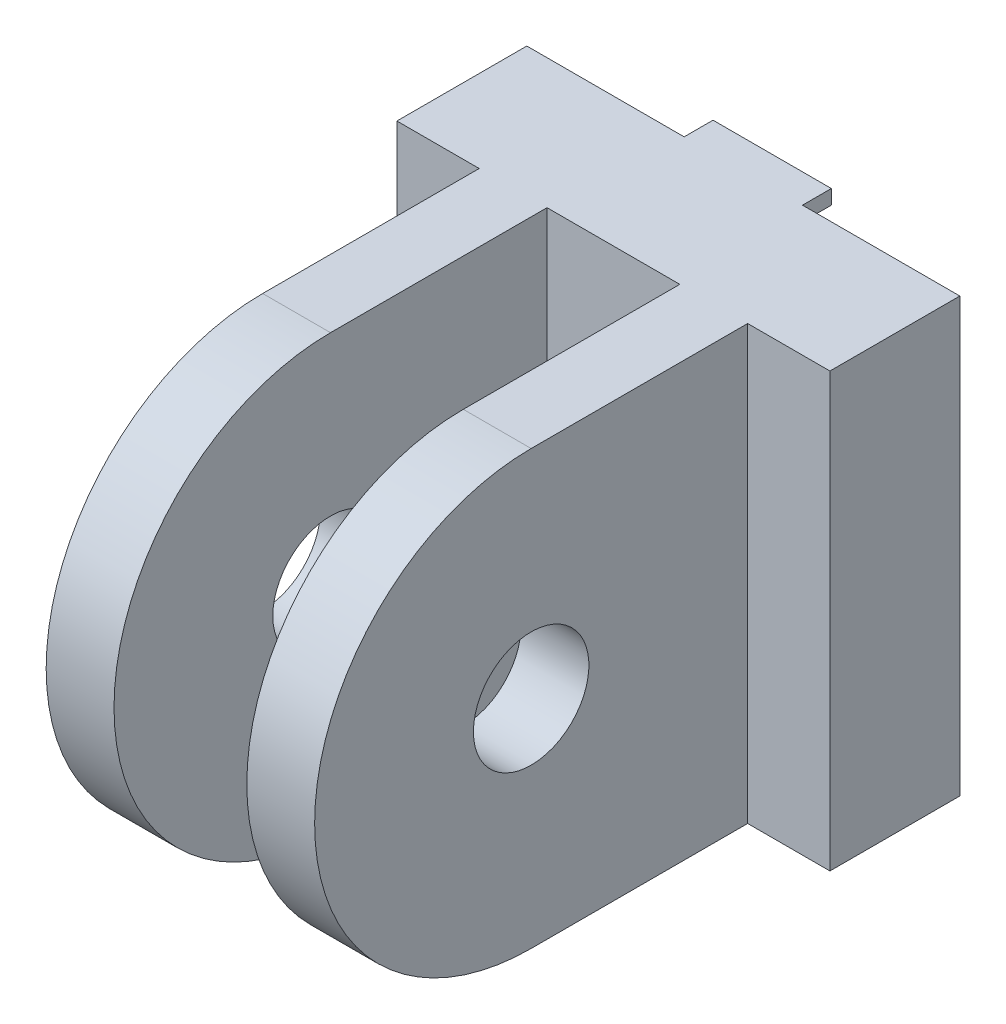
ISO-10303-21;
HEADER;
FILE_DESCRIPTION(('STEP AP214'),'2;1');
FILE_NAME('part.step','',(''),(''),'','','');
FILE_SCHEMA(('AUTOMOTIVE_DESIGN { 1 0 10303 214 1 1 1 1 }'));
ENDSEC;
DATA;
#1=APPLICATION_CONTEXT('core data for automotive mechanical design processes');
#2=APPLICATION_PROTOCOL_DEFINITION('international standard','automotive_design',2000,#1);
#3=PRODUCT_CONTEXT('',#1,'mechanical');
#4=PRODUCT('Part','Part','',(#3));
#5=PRODUCT_RELATED_PRODUCT_CATEGORY('part','',(#4));
#6=PRODUCT_DEFINITION_FORMATION('','',#4);
#7=PRODUCT_DEFINITION_CONTEXT('part definition',#1,'design');
#8=PRODUCT_DEFINITION('design','',#6,#7);
#9=PRODUCT_DEFINITION_SHAPE('','',#8);
#10=(LENGTH_UNIT() NAMED_UNIT(*) SI_UNIT(.MILLI.,.METRE.));
#11=(NAMED_UNIT(*) PLANE_ANGLE_UNIT() SI_UNIT($,.RADIAN.));
#12=(NAMED_UNIT(*) SI_UNIT($,.STERADIAN.) SOLID_ANGLE_UNIT());
#13=UNCERTAINTY_MEASURE_WITH_UNIT(LENGTH_MEASURE(1.E-05),#10,'distance_accuracy_value','');
#14=(GEOMETRIC_REPRESENTATION_CONTEXT(3) GLOBAL_UNCERTAINTY_ASSIGNED_CONTEXT((#13)) GLOBAL_UNIT_ASSIGNED_CONTEXT((#10,
#11,#12)) REPRESENTATION_CONTEXT('',''));
#15=CARTESIAN_POINT('',(0.,0.,0.));
#16=DIRECTION('',(0.,0.,1.));
#17=DIRECTION('',(1.,0.,0.));
#18=AXIS2_PLACEMENT_3D('',#15,#16,#17);
#19=CARTESIAN_POINT('',(15.,15.,0.));
#20=DIRECTION('',(0.,0.,-1.));
#21=DIRECTION('',(-1.,0.,0.));
#22=AXIS2_PLACEMENT_3D('',#19,#20,#21);
#23=PLANE('',#22);
#24=CARTESIAN_POINT('',(0.,0.,0.));
#25=DIRECTION('',(0.,0.,1.));
#26=DIRECTION('',(1.,0.,0.));
#27=AXIS2_PLACEMENT_3D('',#24,#25,#26);
#28=CIRCLE('',#27,4.);
#29=CARTESIAN_POINT('',(4.,0.,0.));
#30=VERTEX_POINT('',#29);
#31=EDGE_CURVE('E315',#30,#30,#28,.T.);
#32=ORIENTED_EDGE('',*,*,#31,.T.);
#33=EDGE_LOOP('',(#32));
#34=FACE_BOUND('',#33,.T.);
#35=DIRECTION('',(1.,0.,0.));
#36=VECTOR('',#35,1.);
#37=CARTESIAN_POINT('',(4.1,-14.,0.));
#38=LINE('',#37,#36);
#39=CARTESIAN_POINT('',(-4.1,-14.,0.));
#40=VERTEX_POINT('',#39);
#41=CARTESIAN_POINT('',(4.1,-14.,0.));
#42=VERTEX_POINT('',#41);
#43=EDGE_CURVE('E428',#40,#42,#38,.T.);
#44=ORIENTED_EDGE('',*,*,#43,.F.);
#45=DIRECTION('',(0.,1.,0.));
#46=VECTOR('',#45,1.);
#47=CARTESIAN_POINT('',(-4.1,-15.,0.));
#48=LINE('',#47,#46);
#49=CARTESIAN_POINT('',(-4.1,-15.,0.));
#50=VERTEX_POINT('',#49);
#51=EDGE_CURVE('E426',#50,#40,#48,.T.);
#52=ORIENTED_EDGE('',*,*,#51,.F.);
#53=DIRECTION('',(1.,0.,0.));
#54=VECTOR('',#53,1.);
#55=CARTESIAN_POINT('',(-15.,-15.,0.));
#56=LINE('',#55,#54);
#57=CARTESIAN_POINT('',(-15.,-15.,0.));
#58=VERTEX_POINT('',#57);
#59=EDGE_CURVE('E198',#58,#50,#56,.T.);
#60=ORIENTED_EDGE('',*,*,#59,.F.);
#61=DIRECTION('',(0.,-1.,0.));
#62=VECTOR('',#61,1.);
#63=CARTESIAN_POINT('',(-15.,-15.,0.));
#64=LINE('',#63,#62);
#65=CARTESIAN_POINT('',(-15.,15.,0.));
#66=VERTEX_POINT('',#65);
#67=EDGE_CURVE('E251',#66,#58,#64,.T.);
#68=ORIENTED_EDGE('',*,*,#67,.F.);
#69=DIRECTION('',(-1.,0.,0.));
#70=VECTOR('',#69,1.);
#71=CARTESIAN_POINT('',(-15.,15.,0.));
#72=LINE('',#71,#70);
#73=CARTESIAN_POINT('',(-4.1,15.,0.));
#74=VERTEX_POINT('',#73);
#75=EDGE_CURVE('E241',#74,#66,#72,.T.);
#76=ORIENTED_EDGE('',*,*,#75,.F.);
#77=DIRECTION('',(0.,1.,0.));
#78=VECTOR('',#77,1.);
#79=CARTESIAN_POINT('',(-4.1,15.,0.));
#80=LINE('',#79,#78);
#81=CARTESIAN_POINT('',(-4.1,14.,0.));
#82=VERTEX_POINT('',#81);
#83=EDGE_CURVE('E210',#82,#74,#80,.T.);
#84=ORIENTED_EDGE('',*,*,#83,.F.);
#85=DIRECTION('',(-1.,0.,0.));
#86=VECTOR('',#85,1.);
#87=CARTESIAN_POINT('',(4.1,14.,0.));
#88=LINE('',#87,#86);
#89=CARTESIAN_POINT('',(4.1,14.,0.));
#90=VERTEX_POINT('',#89);
#91=EDGE_CURVE('E58',#90,#82,#88,.T.);
#92=ORIENTED_EDGE('',*,*,#91,.F.);
#93=DIRECTION('',(0.,-1.,0.));
#94=VECTOR('',#93,1.);
#95=CARTESIAN_POINT('',(4.1,15.,0.));
#96=LINE('',#95,#94);
#97=CARTESIAN_POINT('',(4.1,15.,0.));
#98=VERTEX_POINT('',#97);
#99=EDGE_CURVE('E199',#98,#90,#96,.T.);
#100=ORIENTED_EDGE('',*,*,#99,.F.);
#101=CARTESIAN_POINT('',(15.,15.,0.));
#102=VERTEX_POINT('',#101);
#103=EDGE_CURVE('E244',#102,#98,#72,.T.);
#104=ORIENTED_EDGE('',*,*,#103,.F.);
#105=DIRECTION('',(0.,1.,0.));
#106=VECTOR('',#105,1.);
#107=CARTESIAN_POINT('',(15.,-15.,0.));
#108=LINE('',#107,#106);
#109=CARTESIAN_POINT('',(15.,-15.,0.));
#110=VERTEX_POINT('',#109);
#111=EDGE_CURVE('E245',#110,#102,#108,.T.);
#112=ORIENTED_EDGE('',*,*,#111,.F.);
#113=CARTESIAN_POINT('',(4.1,-15.,0.));
#114=VERTEX_POINT('',#113);
#115=EDGE_CURVE('E254',#114,#110,#56,.T.);
#116=ORIENTED_EDGE('',*,*,#115,.F.);
#117=DIRECTION('',(0.,-1.,0.));
#118=VECTOR('',#117,1.);
#119=CARTESIAN_POINT('',(4.1,-15.,0.));
#120=LINE('',#119,#118);
#121=EDGE_CURVE('E191',#42,#114,#120,.T.);
#122=ORIENTED_EDGE('',*,*,#121,.F.);
#123=EDGE_LOOP('',(#44,#52,#60,#68,#76,#84,#92,#100,#104,#112,#116,#122));
#124=FACE_BOUND('',#123,.T.);
#125=ADVANCED_FACE('F33',(#34,#124),#23,.T.);
#126=CARTESIAN_POINT('',(-15.,15.,9.));
#127=DIRECTION('',(0.,-1.,0.));
#128=DIRECTION('',(0.,0.,-1.));
#129=AXIS2_PLACEMENT_3D('',#126,#127,#128);
#130=PLANE('',#129);
#131=DIRECTION('',(1.,0.,0.));
#132=VECTOR('',#131,1.);
#133=CARTESIAN_POINT('',(-104.5852501602,15.,24.));
#134=LINE('',#133,#132);
#135=CARTESIAN_POINT('',(4.59999999999999,15.,24.));
#136=VERTEX_POINT('',#135);
#137=CARTESIAN_POINT('',(9.3,15.,24.));
#138=VERTEX_POINT('',#137);
#139=EDGE_CURVE('E327',#136,#138,#134,.T.);
#140=ORIENTED_EDGE('',*,*,#139,.T.);
#141=DIRECTION('',(0.,0.,-1.));
#142=VECTOR('',#141,1.);
#143=CARTESIAN_POINT('',(9.3,15.,39.));
#144=LINE('',#143,#142);
#145=CARTESIAN_POINT('',(9.3,15.,9.));
#146=VERTEX_POINT('',#145);
#147=EDGE_CURVE('E354',#138,#146,#144,.T.);
#148=ORIENTED_EDGE('',*,*,#147,.T.);
#149=DIRECTION('',(-1.,0.,0.));
#150=VECTOR('',#149,1.);
#151=CARTESIAN_POINT('',(-15.,15.,9.));
#152=LINE('',#151,#150);
#153=CARTESIAN_POINT('',(15.,15.,9.));
#154=VERTEX_POINT('',#153);
#155=EDGE_CURVE('E265',#154,#146,#152,.T.);
#156=ORIENTED_EDGE('',*,*,#155,.F.);
#157=DIRECTION('',(0.,0.,-1.));
#158=VECTOR('',#157,1.);
#159=CARTESIAN_POINT('',(15.,15.,9.));
#160=LINE('',#159,#158);
#161=EDGE_CURVE('E11',#154,#102,#160,.T.);
#162=ORIENTED_EDGE('',*,*,#161,.T.);
#163=ORIENTED_EDGE('',*,*,#103,.T.);
#164=DIRECTION('',(0.,0.,1.));
#165=VECTOR('',#164,1.);
#166=CARTESIAN_POINT('',(4.1,15.,-2.));
#167=LINE('',#166,#165);
#168=CARTESIAN_POINT('',(4.1,15.,-2.));
#169=VERTEX_POINT('',#168);
#170=EDGE_CURVE('E216',#169,#98,#167,.T.);
#171=ORIENTED_EDGE('',*,*,#170,.F.);
#172=DIRECTION('',(1.,0.,0.));
#173=VECTOR('',#172,1.);
#174=CARTESIAN_POINT('',(4.1,15.,-2.));
#175=LINE('',#174,#173);
#176=CARTESIAN_POINT('',(-4.1,15.,-2.));
#177=VERTEX_POINT('',#176);
#178=EDGE_CURVE('E214',#177,#169,#175,.T.);
#179=ORIENTED_EDGE('',*,*,#178,.F.);
#180=DIRECTION('',(0.,0.,1.));
#181=VECTOR('',#180,1.);
#182=CARTESIAN_POINT('',(-4.1,15.,-2.));
#183=LINE('',#182,#181);
#184=EDGE_CURVE('E227',#177,#74,#183,.T.);
#185=ORIENTED_EDGE('',*,*,#184,.T.);
#186=ORIENTED_EDGE('',*,*,#75,.T.);
#187=DIRECTION('',(0.,0.,-1.));
#188=VECTOR('',#187,1.);
#189=CARTESIAN_POINT('',(-15.,15.,9.));
#190=LINE('',#189,#188);
#191=CARTESIAN_POINT('',(-15.,15.,9.));
#192=VERTEX_POINT('',#191);
#193=EDGE_CURVE('E42',#192,#66,#190,.T.);
#194=ORIENTED_EDGE('',*,*,#193,.F.);
#195=CARTESIAN_POINT('',(-9.3,15.,9.));
#196=VERTEX_POINT('',#195);
#197=EDGE_CURVE('E271',#196,#192,#152,.T.);
#198=ORIENTED_EDGE('',*,*,#197,.F.);
#199=DIRECTION('',(0.,0.,-1.));
#200=VECTOR('',#199,1.);
#201=CARTESIAN_POINT('',(-9.3,15.,39.));
#202=LINE('',#201,#200);
#203=CARTESIAN_POINT('',(-9.3,15.,24.));
#204=VERTEX_POINT('',#203);
#205=EDGE_CURVE('E288',#204,#196,#202,.T.);
#206=ORIENTED_EDGE('',*,*,#205,.F.);
#207=CARTESIAN_POINT('',(-4.59999999999999,15.,24.));
#208=VERTEX_POINT('',#207);
#209=EDGE_CURVE('E330',#204,#208,#134,.T.);
#210=ORIENTED_EDGE('',*,*,#209,.T.);
#211=DIRECTION('',(0.,0.,-1.));
#212=VECTOR('',#211,1.);
#213=CARTESIAN_POINT('',(-4.6,15.,39.));
#214=LINE('',#213,#212);
#215=CARTESIAN_POINT('',(-4.6,15.,9.));
#216=VERTEX_POINT('',#215);
#217=EDGE_CURVE('E302',#208,#216,#214,.T.);
#218=ORIENTED_EDGE('',*,*,#217,.T.);
#219=CARTESIAN_POINT('',(4.6,15.,9.));
#220=VERTEX_POINT('',#219);
#221=EDGE_CURVE('E270',#220,#216,#152,.T.);
#222=ORIENTED_EDGE('',*,*,#221,.F.);
#223=DIRECTION('',(0.,0.,-1.));
#224=VECTOR('',#223,1.);
#225=CARTESIAN_POINT('',(4.6,15.,39.));
#226=LINE('',#225,#224);
#227=EDGE_CURVE('E352',#136,#220,#226,.T.);
#228=ORIENTED_EDGE('',*,*,#227,.F.);
#229=EDGE_LOOP('',(#140,#148,#156,#162,#163,#171,#179,#185,#186,#194,#198,#206,#210,#218,#222,#228));
#230=FACE_BOUND('',#229,.T.);
#231=ADVANCED_FACE('F374',(#230),#130,.F.);
#232=CARTESIAN_POINT('',(15.,15.,9.));
#233=DIRECTION('',(0.,0.,-1.));
#234=DIRECTION('',(-1.,0.,0.));
#235=AXIS2_PLACEMENT_3D('',#232,#233,#234);
#236=PLANE('',#235);
#237=DIRECTION('',(0.,1.,0.));
#238=VECTOR('',#237,1.);
#239=CARTESIAN_POINT('',(9.3,-15.,9.));
#240=LINE('',#239,#238);
#241=CARTESIAN_POINT('',(9.3,-15.,9.));
#242=VERTEX_POINT('',#241);
#243=EDGE_CURVE('E341',#242,#146,#240,.T.);
#244=ORIENTED_EDGE('',*,*,#243,.F.);
#245=DIRECTION('',(1.,0.,0.));
#246=VECTOR('',#245,1.);
#247=CARTESIAN_POINT('',(-15.,-15.,9.));
#248=LINE('',#247,#246);
#249=CARTESIAN_POINT('',(15.,-15.,9.));
#250=VERTEX_POINT('',#249);
#251=EDGE_CURVE('E283',#242,#250,#248,.T.);
#252=ORIENTED_EDGE('',*,*,#251,.T.);
#253=DIRECTION('',(0.,1.,0.));
#254=VECTOR('',#253,1.);
#255=CARTESIAN_POINT('',(15.,-15.,9.));
#256=LINE('',#255,#254);
#257=EDGE_CURVE('E256',#250,#154,#256,.T.);
#258=ORIENTED_EDGE('',*,*,#257,.T.);
#259=ORIENTED_EDGE('',*,*,#155,.T.);
#260=EDGE_LOOP('',(#244,#252,#258,#259));
#261=FACE_BOUND('',#260,.T.);
#262=ADVANCED_FACE('F382',(#261),#236,.F.);
#263=CARTESIAN_POINT('',(0.,0.,9.));
#264=DIRECTION('',(0.,0.,1.));
#265=DIRECTION('',(1.,0.,0.));
#266=AXIS2_PLACEMENT_3D('',#263,#264,#265);
#267=CIRCLE('',#266,4.);
#268=CARTESIAN_POINT('',(4.,0.,9.));
#269=VERTEX_POINT('',#268);
#270=EDGE_CURVE('E320',#269,#269,#267,.T.);
#271=ORIENTED_EDGE('',*,*,#270,.F.);
#272=EDGE_LOOP('',(#271));
#273=FACE_BOUND('',#272,.T.);
#274=DIRECTION('',(0.,-1.,0.));
#275=VECTOR('',#274,1.);
#276=CARTESIAN_POINT('',(4.6,-15.,9.));
#277=LINE('',#276,#275);
#278=CARTESIAN_POINT('',(4.6,-15.,9.));
#279=VERTEX_POINT('',#278);
#280=EDGE_CURVE('E345',#220,#279,#277,.T.);
#281=ORIENTED_EDGE('',*,*,#280,.F.);
#282=ORIENTED_EDGE('',*,*,#221,.T.);
#283=DIRECTION('',(0.,1.,0.));
#284=VECTOR('',#283,1.);
#285=CARTESIAN_POINT('',(-4.6,-15.,9.));
#286=LINE('',#285,#284);
#287=CARTESIAN_POINT('',(-4.6,-15.,9.));
#288=VERTEX_POINT('',#287);
#289=EDGE_CURVE('E300',#288,#216,#286,.T.);
#290=ORIENTED_EDGE('',*,*,#289,.F.);
#291=EDGE_CURVE('E407',#288,#279,#248,.T.);
#292=ORIENTED_EDGE('',*,*,#291,.T.);
#293=EDGE_LOOP('',(#281,#282,#290,#292));
#294=FACE_BOUND('',#293,.T.);
#295=ADVANCED_FACE('F399',(#273,#294),#236,.F.);
#296=DIRECTION('',(0.,-1.,0.));
#297=VECTOR('',#296,1.);
#298=CARTESIAN_POINT('',(-9.3,-15.,9.));
#299=LINE('',#298,#297);
#300=CARTESIAN_POINT('',(-9.3,-15.,9.));
#301=VERTEX_POINT('',#300);
#302=EDGE_CURVE('E294',#196,#301,#299,.T.);
#303=ORIENTED_EDGE('',*,*,#302,.F.);
#304=ORIENTED_EDGE('',*,*,#197,.T.);
#305=DIRECTION('',(0.,-1.,0.));
#306=VECTOR('',#305,1.);
#307=CARTESIAN_POINT('',(-15.,-15.,9.));
#308=LINE('',#307,#306);
#309=CARTESIAN_POINT('',(-15.,-15.,9.));
#310=VERTEX_POINT('',#309);
#311=EDGE_CURVE('E269',#192,#310,#308,.T.);
#312=ORIENTED_EDGE('',*,*,#311,.T.);
#313=EDGE_CURVE('E261',#310,#301,#248,.T.);
#314=ORIENTED_EDGE('',*,*,#313,.T.);
#315=EDGE_LOOP('',(#303,#304,#312,#314));
#316=FACE_BOUND('',#315,.T.);
#317=ADVANCED_FACE('F371',(#316),#236,.F.);
#318=CARTESIAN_POINT('',(15.,-15.,9.));
#319=DIRECTION('',(-1.,0.,0.));
#320=DIRECTION('',(0.,0.,1.));
#321=AXIS2_PLACEMENT_3D('',#318,#319,#320);
#322=PLANE('',#321);
#323=ORIENTED_EDGE('',*,*,#111,.T.);
#324=ORIENTED_EDGE('',*,*,#161,.F.);
#325=ORIENTED_EDGE('',*,*,#257,.F.);
#326=DIRECTION('',(0.,0.,-1.));
#327=VECTOR('',#326,1.);
#328=CARTESIAN_POINT('',(15.,-15.,9.));
#329=LINE('',#328,#327);
#330=EDGE_CURVE('E257',#250,#110,#329,.T.);
#331=ORIENTED_EDGE('',*,*,#330,.T.);
#332=EDGE_LOOP('',(#323,#324,#325,#331));
#333=FACE_BOUND('',#332,.T.);
#334=ADVANCED_FACE('F35',(#333),#322,.F.);
#335=CARTESIAN_POINT('',(-15.,-15.,9.));
#336=DIRECTION('',(1.,0.,0.));
#337=DIRECTION('',(0.,0.,-1.));
#338=AXIS2_PLACEMENT_3D('',#335,#336,#337);
#339=PLANE('',#338);
#340=ORIENTED_EDGE('',*,*,#67,.T.);
#341=DIRECTION('',(0.,0.,-1.));
#342=VECTOR('',#341,1.);
#343=CARTESIAN_POINT('',(-15.,-15.,9.));
#344=LINE('',#343,#342);
#345=EDGE_CURVE('E260',#310,#58,#344,.T.);
#346=ORIENTED_EDGE('',*,*,#345,.F.);
#347=ORIENTED_EDGE('',*,*,#311,.F.);
#348=ORIENTED_EDGE('',*,*,#193,.T.);
#349=EDGE_LOOP('',(#340,#346,#347,#348));
#350=FACE_BOUND('',#349,.T.);
#351=ADVANCED_FACE('F424',(#350),#339,.F.);
#352=CARTESIAN_POINT('',(-15.,-15.,9.));
#353=DIRECTION('',(0.,1.,0.));
#354=DIRECTION('',(0.,0.,1.));
#355=AXIS2_PLACEMENT_3D('',#352,#353,#354);
#356=PLANE('',#355);
#357=DIRECTION('',(0.,0.,-1.));
#358=VECTOR('',#357,1.);
#359=CARTESIAN_POINT('',(9.3,-15.,39.));
#360=LINE('',#359,#358);
#361=CARTESIAN_POINT('',(9.3,-15.,24.));
#362=VERTEX_POINT('',#361);
#363=EDGE_CURVE('E348',#362,#242,#360,.T.);
#364=ORIENTED_EDGE('',*,*,#363,.F.);
#365=DIRECTION('',(1.,0.,0.));
#366=VECTOR('',#365,1.);
#367=CARTESIAN_POINT('',(-104.5852501602,-15.,24.));
#368=LINE('',#367,#366);
#369=CARTESIAN_POINT('',(4.59999999999999,-15.,24.));
#370=VERTEX_POINT('',#369);
#371=EDGE_CURVE('E326',#370,#362,#368,.T.);
#372=ORIENTED_EDGE('',*,*,#371,.F.);
#373=DIRECTION('',(0.,0.,-1.));
#374=VECTOR('',#373,1.);
#375=CARTESIAN_POINT('',(4.6,-15.,39.));
#376=LINE('',#375,#374);
#377=EDGE_CURVE('E350',#370,#279,#376,.T.);
#378=ORIENTED_EDGE('',*,*,#377,.T.);
#379=ORIENTED_EDGE('',*,*,#291,.F.);
#380=DIRECTION('',(0.,0.,-1.));
#381=VECTOR('',#380,1.);
#382=CARTESIAN_POINT('',(-4.6,-15.,39.));
#383=LINE('',#382,#381);
#384=CARTESIAN_POINT('',(-4.59999999999999,-15.,24.));
#385=VERTEX_POINT('',#384);
#386=EDGE_CURVE('E289',#385,#288,#383,.T.);
#387=ORIENTED_EDGE('',*,*,#386,.F.);
#388=CARTESIAN_POINT('',(-9.3,-15.,24.));
#389=VERTEX_POINT('',#388);
#390=EDGE_CURVE('E331',#389,#385,#368,.T.);
#391=ORIENTED_EDGE('',*,*,#390,.F.);
#392=DIRECTION('',(0.,0.,-1.));
#393=VECTOR('',#392,1.);
#394=CARTESIAN_POINT('',(-9.3,-15.,39.));
#395=LINE('',#394,#393);
#396=EDGE_CURVE('E285',#389,#301,#395,.T.);
#397=ORIENTED_EDGE('',*,*,#396,.T.);
#398=ORIENTED_EDGE('',*,*,#313,.F.);
#399=ORIENTED_EDGE('',*,*,#345,.T.);
#400=ORIENTED_EDGE('',*,*,#59,.T.);
#401=DIRECTION('',(0.,0.,1.));
#402=VECTOR('',#401,1.);
#403=CARTESIAN_POINT('',(-4.1,-15.,-2.));
#404=LINE('',#403,#402);
#405=CARTESIAN_POINT('',(-4.1,-15.,-2.));
#406=VERTEX_POINT('',#405);
#407=EDGE_CURVE('E176',#406,#50,#404,.T.);
#408=ORIENTED_EDGE('',*,*,#407,.F.);
#409=DIRECTION('',(-1.,0.,0.));
#410=VECTOR('',#409,1.);
#411=CARTESIAN_POINT('',(4.1,-15.,-2.));
#412=LINE('',#411,#410);
#413=CARTESIAN_POINT('',(4.1,-15.,-2.));
#414=VERTEX_POINT('',#413);
#415=EDGE_CURVE('E183',#414,#406,#412,.T.);
#416=ORIENTED_EDGE('',*,*,#415,.F.);
#417=DIRECTION('',(0.,0.,1.));
#418=VECTOR('',#417,1.);
#419=CARTESIAN_POINT('',(4.1,-15.,-2.));
#420=LINE('',#419,#418);
#421=EDGE_CURVE('E435',#414,#114,#420,.T.);
#422=ORIENTED_EDGE('',*,*,#421,.T.);
#423=ORIENTED_EDGE('',*,*,#115,.T.);
#424=ORIENTED_EDGE('',*,*,#330,.F.);
#425=ORIENTED_EDGE('',*,*,#251,.F.);
#426=EDGE_LOOP('',(#364,#372,#378,#379,#387,#391,#397,#398,#399,#400,#408,#416,#422,#423,#424,#425));
#427=FACE_BOUND('',#426,.T.);
#428=ADVANCED_FACE('F195',(#427),#356,.F.);
#429=CARTESIAN_POINT('',(-4.6,-15.,39.));
#430=DIRECTION('',(-1.,0.,0.));
#431=DIRECTION('',(0.,0.,1.));
#432=AXIS2_PLACEMENT_3D('',#429,#430,#431);
#433=PLANE('',#432);
#434=CARTESIAN_POINT('',(-4.6,0.,24.));
#435=DIRECTION('',(-1.,0.,0.));
#436=DIRECTION('',(0.,0.,1.));
#437=AXIS2_PLACEMENT_3D('',#434,#435,#436);
#438=CIRCLE('',#437,4.00000000000001);
#439=CARTESIAN_POINT('',(-4.6,0.,28.));
#440=VERTEX_POINT('',#439);
#441=EDGE_CURVE('E312',#440,#440,#438,.T.);
#442=ORIENTED_EDGE('',*,*,#441,.T.);
#443=EDGE_LOOP('',(#442));
#444=FACE_BOUND('',#443,.T.);
#445=CARTESIAN_POINT('',(-4.59999999999999,0.,24.));
#446=DIRECTION('',(-1.,0.,0.));
#447=DIRECTION('',(0.,0.,1.));
#448=AXIS2_PLACEMENT_3D('',#445,#446,#447);
#449=CIRCLE('',#448,15.);
#450=EDGE_CURVE('E336',#208,#385,#449,.F.);
#451=ORIENTED_EDGE('',*,*,#450,.T.);
#452=ORIENTED_EDGE('',*,*,#386,.T.);
#453=ORIENTED_EDGE('',*,*,#289,.T.);
#454=ORIENTED_EDGE('',*,*,#217,.F.);
#455=EDGE_LOOP('',(#451,#452,#453,#454));
#456=FACE_BOUND('',#455,.T.);
#457=ADVANCED_FACE('F412',(#444,#456),#433,.F.);
#458=CARTESIAN_POINT('',(-9.3,-15.,39.));
#459=DIRECTION('',(1.,0.,0.));
#460=DIRECTION('',(0.,0.,-1.));
#461=AXIS2_PLACEMENT_3D('',#458,#459,#460);
#462=PLANE('',#461);
#463=CARTESIAN_POINT('',(-9.3,0.,24.));
#464=DIRECTION('',(-1.,0.,0.));
#465=DIRECTION('',(0.,0.,1.));
#466=AXIS2_PLACEMENT_3D('',#463,#464,#465);
#467=CIRCLE('',#466,4.00000000000001);
#468=CARTESIAN_POINT('',(-9.3,0.,28.));
#469=VERTEX_POINT('',#468);
#470=EDGE_CURVE('E308',#469,#469,#467,.T.);
#471=ORIENTED_EDGE('',*,*,#470,.F.);
#472=EDGE_LOOP('',(#471));
#473=FACE_BOUND('',#472,.T.);
#474=ORIENTED_EDGE('',*,*,#396,.F.);
#475=CARTESIAN_POINT('',(-9.3,0.,24.));
#476=DIRECTION('',(1.,0.,0.));
#477=DIRECTION('',(0.,0.,-1.));
#478=AXIS2_PLACEMENT_3D('',#475,#476,#477);
#479=CIRCLE('',#478,15.);
#480=EDGE_CURVE('E339',#389,#204,#479,.F.);
#481=ORIENTED_EDGE('',*,*,#480,.T.);
#482=ORIENTED_EDGE('',*,*,#205,.T.);
#483=ORIENTED_EDGE('',*,*,#302,.T.);
#484=EDGE_LOOP('',(#474,#481,#482,#483));
#485=FACE_BOUND('',#484,.T.);
#486=ADVANCED_FACE('F366',(#473,#485),#462,.F.);
#487=CARTESIAN_POINT('',(9.3,-15.,39.));
#488=DIRECTION('',(-1.,0.,0.));
#489=DIRECTION('',(0.,0.,1.));
#490=AXIS2_PLACEMENT_3D('',#487,#488,#489);
#491=PLANE('',#490);
#492=CARTESIAN_POINT('',(9.3,0.,24.));
#493=DIRECTION('',(-1.,0.,0.));
#494=DIRECTION('',(0.,0.,1.));
#495=AXIS2_PLACEMENT_3D('',#492,#493,#494);
#496=CIRCLE('',#495,4.00000000000001);
#497=CARTESIAN_POINT('',(9.3,0.,28.));
#498=VERTEX_POINT('',#497);
#499=EDGE_CURVE('E307',#498,#498,#496,.T.);
#500=ORIENTED_EDGE('',*,*,#499,.T.);
#501=EDGE_LOOP('',(#500));
#502=FACE_BOUND('',#501,.T.);
#503=CARTESIAN_POINT('',(9.3,0.,24.));
#504=DIRECTION('',(-1.,0.,0.));
#505=DIRECTION('',(0.,0.,1.));
#506=AXIS2_PLACEMENT_3D('',#503,#504,#505);
#507=CIRCLE('',#506,15.);
#508=EDGE_CURVE('E337',#138,#362,#507,.F.);
#509=ORIENTED_EDGE('',*,*,#508,.T.);
#510=ORIENTED_EDGE('',*,*,#363,.T.);
#511=ORIENTED_EDGE('',*,*,#243,.T.);
#512=ORIENTED_EDGE('',*,*,#147,.F.);
#513=EDGE_LOOP('',(#509,#510,#511,#512));
#514=FACE_BOUND('',#513,.T.);
#515=ADVANCED_FACE('F440',(#502,#514),#491,.F.);
#516=CARTESIAN_POINT('',(4.6,-15.,39.));
#517=DIRECTION('',(1.,0.,0.));
#518=DIRECTION('',(0.,0.,-1.));
#519=AXIS2_PLACEMENT_3D('',#516,#517,#518);
#520=PLANE('',#519);
#521=CARTESIAN_POINT('',(4.6,0.,24.));
#522=DIRECTION('',(1.,0.,0.));
#523=DIRECTION('',(0.,0.,-1.));
#524=AXIS2_PLACEMENT_3D('',#521,#522,#523);
#525=CIRCLE('',#524,4.00000000000001);
#526=CARTESIAN_POINT('',(4.6,0.,28.));
#527=VERTEX_POINT('',#526);
#528=EDGE_CURVE('E304',#527,#527,#525,.T.);
#529=ORIENTED_EDGE('',*,*,#528,.T.);
#530=EDGE_LOOP('',(#529));
#531=FACE_BOUND('',#530,.T.);
#532=ORIENTED_EDGE('',*,*,#377,.F.);
#533=CARTESIAN_POINT('',(4.59999999999999,0.,24.));
#534=DIRECTION('',(1.,0.,0.));
#535=DIRECTION('',(0.,0.,-1.));
#536=AXIS2_PLACEMENT_3D('',#533,#534,#535);
#537=CIRCLE('',#536,15.);
#538=EDGE_CURVE('E334',#370,#136,#537,.F.);
#539=ORIENTED_EDGE('',*,*,#538,.T.);
#540=ORIENTED_EDGE('',*,*,#227,.T.);
#541=ORIENTED_EDGE('',*,*,#280,.T.);
#542=EDGE_LOOP('',(#532,#539,#540,#541));
#543=FACE_BOUND('',#542,.T.);
#544=ADVANCED_FACE('F444',(#531,#543),#520,.F.);
#545=CARTESIAN_POINT('',(-104.5852501602,0.,24.));
#546=DIRECTION('',(1.,0.,0.));
#547=DIRECTION('',(0.,0.,-1.));
#548=AXIS2_PLACEMENT_3D('',#545,#546,#547);
#549=CYLINDRICAL_SURFACE('',#548,15.);
#550=ORIENTED_EDGE('',*,*,#371,.T.);
#551=ORIENTED_EDGE('',*,*,#508,.F.);
#552=ORIENTED_EDGE('',*,*,#139,.F.);
#553=ORIENTED_EDGE('',*,*,#538,.F.);
#554=EDGE_LOOP('',(#550,#551,#552,#553));
#555=FACE_BOUND('',#554,.T.);
#556=ADVANCED_FACE('F443',(#555),#549,.T.);
#557=ORIENTED_EDGE('',*,*,#390,.T.);
#558=ORIENTED_EDGE('',*,*,#450,.F.);
#559=ORIENTED_EDGE('',*,*,#209,.F.);
#560=ORIENTED_EDGE('',*,*,#480,.F.);
#561=EDGE_LOOP('',(#557,#558,#559,#560));
#562=FACE_BOUND('',#561,.T.);
#563=ADVANCED_FACE('F417',(#562),#549,.T.);
#564=CARTESIAN_POINT('',(15.,0.,24.));
#565=DIRECTION('',(-1.,0.,0.));
#566=DIRECTION('',(0.,0.,1.));
#567=AXIS2_PLACEMENT_3D('',#564,#565,#566);
#568=CYLINDRICAL_SURFACE('',#567,4.00000000000001);
#569=CARTESIAN_POINT('',(4.6,0.,28.));
#570=CARTESIAN_POINT('',(4.64895833333333,0.,28.));
#571=CARTESIAN_POINT('',(4.69791666666667,0.,28.));
#572=CARTESIAN_POINT('',(4.79583333333333,0.,28.));
#573=CARTESIAN_POINT('',(4.84479166666667,0.,28.));
#574=CARTESIAN_POINT('',(4.94270833333333,0.,28.));
#575=CARTESIAN_POINT('',(4.99166666666667,0.,28.));
#576=CARTESIAN_POINT('',(5.08958333333333,0.,28.));
#577=CARTESIAN_POINT('',(5.13854166666667,0.,28.));
#578=CARTESIAN_POINT('',(5.23645833333333,0.,28.));
#579=CARTESIAN_POINT('',(5.28541666666667,0.,28.));
#580=CARTESIAN_POINT('',(5.38333333333333,0.,28.));
#581=CARTESIAN_POINT('',(5.43229166666667,0.,28.));
#582=CARTESIAN_POINT('',(5.53020833333333,0.,28.));
#583=CARTESIAN_POINT('',(5.57916666666667,0.,28.));
#584=CARTESIAN_POINT('',(5.67708333333333,0.,28.));
#585=CARTESIAN_POINT('',(5.72604166666667,0.,28.));
#586=CARTESIAN_POINT('',(5.82395833333333,0.,28.));
#587=CARTESIAN_POINT('',(5.87291666666667,0.,28.));
#588=CARTESIAN_POINT('',(5.97083333333333,0.,28.));
#589=CARTESIAN_POINT('',(6.01979166666667,0.,28.));
#590=CARTESIAN_POINT('',(6.11770833333333,0.,28.));
#591=CARTESIAN_POINT('',(6.16666666666667,0.,28.));
#592=CARTESIAN_POINT('',(6.26458333333333,0.,28.));
#593=CARTESIAN_POINT('',(6.31354166666667,0.,28.));
#594=CARTESIAN_POINT('',(6.41145833333333,0.,28.));
#595=CARTESIAN_POINT('',(6.46041666666667,0.,28.));
#596=CARTESIAN_POINT('',(6.55833333333333,0.,28.));
#597=CARTESIAN_POINT('',(6.60729166666667,0.,28.));
#598=CARTESIAN_POINT('',(6.70520833333333,0.,28.));
#599=CARTESIAN_POINT('',(6.75416666666667,0.,28.));
#600=CARTESIAN_POINT('',(6.85208333333333,0.,28.));
#601=CARTESIAN_POINT('',(6.90104166666667,0.,28.));
#602=CARTESIAN_POINT('',(6.99895833333333,0.,28.));
#603=CARTESIAN_POINT('',(7.04791666666667,0.,28.));
#604=CARTESIAN_POINT('',(7.14583333333333,0.,28.));
#605=CARTESIAN_POINT('',(7.19479166666667,0.,28.));
#606=CARTESIAN_POINT('',(7.29270833333333,0.,28.));
#607=CARTESIAN_POINT('',(7.34166666666667,0.,28.));
#608=CARTESIAN_POINT('',(7.43958333333333,0.,28.));
#609=CARTESIAN_POINT('',(7.48854166666667,0.,28.));
#610=CARTESIAN_POINT('',(7.58645833333333,0.,28.));
#611=CARTESIAN_POINT('',(7.63541666666667,0.,28.));
#612=CARTESIAN_POINT('',(7.73333333333333,0.,28.));
#613=CARTESIAN_POINT('',(7.78229166666667,0.,28.));
#614=CARTESIAN_POINT('',(7.88020833333333,0.,28.));
#615=CARTESIAN_POINT('',(7.92916666666667,0.,28.));
#616=CARTESIAN_POINT('',(8.02708333333333,0.,28.));
#617=CARTESIAN_POINT('',(8.07604166666667,0.,28.));
#618=CARTESIAN_POINT('',(8.17395833333333,0.,28.));
#619=CARTESIAN_POINT('',(8.22291666666667,0.,28.));
#620=CARTESIAN_POINT('',(8.32083333333333,0.,28.));
#621=CARTESIAN_POINT('',(8.36979166666667,0.,28.));
#622=CARTESIAN_POINT('',(8.46770833333333,0.,28.));
#623=CARTESIAN_POINT('',(8.51666666666667,0.,28.));
#624=CARTESIAN_POINT('',(8.61458333333333,0.,28.));
#625=CARTESIAN_POINT('',(8.66354166666667,0.,28.));
#626=CARTESIAN_POINT('',(8.76145833333334,0.,28.));
#627=CARTESIAN_POINT('',(8.81041666666667,0.,28.));
#628=CARTESIAN_POINT('',(8.90833333333333,0.,28.));
#629=CARTESIAN_POINT('',(8.95729166666667,0.,28.));
#630=CARTESIAN_POINT('',(9.05520833333333,0.,28.));
#631=CARTESIAN_POINT('',(9.10416666666667,0.,28.));
#632=CARTESIAN_POINT('',(9.20208333333333,0.,28.));
#633=CARTESIAN_POINT('',(9.25104166666667,0.,28.));
#634=CARTESIAN_POINT('',(9.3,0.,28.));
#635=B_SPLINE_CURVE_WITH_KNOTS('',3,(#569,#570,#571,#572,#573,#574,#575,#576,#577,#578,#579,
#580,#581,#582,#583,#584,#585,#586,#587,#588,#589,#590,#591,#592,#593,#594,#595,#596,#597,#598,
#599,#600,#601,#602,#603,#604,#605,#606,#607,#608,#609,#610,#611,#612,#613,#614,#615,#616,#617,
#618,#619,#620,#621,#622,#623,#624,#625,#626,#627,#628,#629,#630,#631,#632,#633,#634),
.UNSPECIFIED.,.F.,.F.,(4,2,2,2,2,2,2,2,2,2,2,2,2,2,2,2,2,2,2,2,2,2,2,2,2,2,2,2,2,2,2,2,4),(0.,
0.146874999999999,0.293750000000001,0.440625,0.587499999999999,0.734375000000001,0.88125,
1.028125,1.175,1.321875,1.46875,1.615625,1.7625,1.909375,2.05625,2.203125,2.35,2.496875,2.64375,
2.790625,2.9375,3.084375,3.23125,3.378125,3.525,3.671875,3.81875,3.965625,4.1125,4.259375,
4.40625,4.553125,4.7),.UNSPECIFIED.);
#636=EDGE_CURVE('BSEAM589',#527,#498,#635,.T.);
#637=ORIENTED_EDGE('',*,*,#528,.F.);
#638=ORIENTED_EDGE('',*,*,#499,.F.);
#639=ORIENTED_EDGE('',*,*,#636,.T.);
#640=ORIENTED_EDGE('',*,*,#636,.F.);
#641=EDGE_LOOP('',(#637,#639,#638,#640));
#642=FACE_BOUND('',#641,.T.);
#643=ADVANCED_FACE('F589',(#642),#568,.F.);
#644=ORIENTED_EDGE('',*,*,#470,.T.);
#645=EDGE_LOOP('',(#644));
#646=FACE_BOUND('',#645,.T.);
#647=ORIENTED_EDGE('',*,*,#441,.F.);
#648=EDGE_LOOP('',(#647));
#649=FACE_BOUND('',#648,.T.);
#650=ADVANCED_FACE('F489',(#646,#649),#568,.F.);
#651=CARTESIAN_POINT('',(0.,0.,0.));
#652=DIRECTION('',(0.,0.,1.));
#653=DIRECTION('',(1.,0.,0.));
#654=AXIS2_PLACEMENT_3D('',#651,#652,#653);
#655=CYLINDRICAL_SURFACE('',#654,4.);
#656=ORIENTED_EDGE('',*,*,#31,.F.);
#657=EDGE_LOOP('',(#656));
#658=FACE_BOUND('',#657,.T.);
#659=ORIENTED_EDGE('',*,*,#270,.T.);
#660=EDGE_LOOP('',(#659));
#661=FACE_BOUND('',#660,.T.);
#662=ADVANCED_FACE('F397',(#658,#661),#655,.F.);
#663=CARTESIAN_POINT('',(4.1,15.,-2.));
#664=DIRECTION('',(-1.,0.,0.));
#665=DIRECTION('',(0.,0.,1.));
#666=AXIS2_PLACEMENT_3D('',#663,#664,#665);
#667=PLANE('',#666);
#668=ORIENTED_EDGE('',*,*,#99,.T.);
#669=DIRECTION('',(0.,0.,1.));
#670=VECTOR('',#669,1.);
#671=CARTESIAN_POINT('',(4.1,14.,-2.));
#672=LINE('',#671,#670);
#673=CARTESIAN_POINT('',(4.1,14.,-2.));
#674=VERTEX_POINT('',#673);
#675=EDGE_CURVE('E233',#674,#90,#672,.T.);
#676=ORIENTED_EDGE('',*,*,#675,.F.);
#677=DIRECTION('',(0.,-1.,0.));
#678=VECTOR('',#677,1.);
#679=CARTESIAN_POINT('',(4.1,15.,-2.));
#680=LINE('',#679,#678);
#681=EDGE_CURVE('E206',#169,#674,#680,.T.);
#682=ORIENTED_EDGE('',*,*,#681,.F.);
#683=ORIENTED_EDGE('',*,*,#170,.T.);
#684=EDGE_LOOP('',(#668,#676,#682,#683));
#685=FACE_BOUND('',#684,.T.);
#686=ADVANCED_FACE('F392',(#685),#667,.F.);
#687=CARTESIAN_POINT('',(4.1,14.,-2.));
#688=DIRECTION('',(0.,1.,0.));
#689=DIRECTION('',(0.,0.,1.));
#690=AXIS2_PLACEMENT_3D('',#687,#688,#689);
#691=PLANE('',#690);
#692=ORIENTED_EDGE('',*,*,#91,.T.);
#693=DIRECTION('',(0.,0.,1.));
#694=VECTOR('',#693,1.);
#695=CARTESIAN_POINT('',(-4.1,14.,-2.));
#696=LINE('',#695,#694);
#697=CARTESIAN_POINT('',(-4.1,14.,-2.));
#698=VERTEX_POINT('',#697);
#699=EDGE_CURVE('E220',#698,#82,#696,.T.);
#700=ORIENTED_EDGE('',*,*,#699,.F.);
#701=DIRECTION('',(-1.,0.,0.));
#702=VECTOR('',#701,1.);
#703=CARTESIAN_POINT('',(4.1,14.,-2.));
#704=LINE('',#703,#702);
#705=EDGE_CURVE('E209',#674,#698,#704,.T.);
#706=ORIENTED_EDGE('',*,*,#705,.F.);
#707=ORIENTED_EDGE('',*,*,#675,.T.);
#708=EDGE_LOOP('',(#692,#700,#706,#707));
#709=FACE_BOUND('',#708,.T.);
#710=ADVANCED_FACE('F524',(#709),#691,.F.);
#711=CARTESIAN_POINT('',(-4.1,15.,-2.));
#712=DIRECTION('',(1.,0.,0.));
#713=DIRECTION('',(0.,0.,-1.));
#714=AXIS2_PLACEMENT_3D('',#711,#712,#713);
#715=PLANE('',#714);
#716=ORIENTED_EDGE('',*,*,#83,.T.);
#717=ORIENTED_EDGE('',*,*,#184,.F.);
#718=DIRECTION('',(0.,1.,0.));
#719=VECTOR('',#718,1.);
#720=CARTESIAN_POINT('',(-4.1,15.,-2.));
#721=LINE('',#720,#719);
#722=EDGE_CURVE('E212',#698,#177,#721,.T.);
#723=ORIENTED_EDGE('',*,*,#722,.F.);
#724=ORIENTED_EDGE('',*,*,#699,.T.);
#725=EDGE_LOOP('',(#716,#717,#723,#724));
#726=FACE_BOUND('',#725,.T.);
#727=ADVANCED_FACE('F533',(#726),#715,.F.);
#728=CARTESIAN_POINT('',(4.1,14.,-2.));
#729=DIRECTION('',(0.,0.,-1.));
#730=DIRECTION('',(-1.,0.,0.));
#731=AXIS2_PLACEMENT_3D('',#728,#729,#730);
#732=PLANE('',#731);
#733=ORIENTED_EDGE('',*,*,#681,.T.);
#734=ORIENTED_EDGE('',*,*,#705,.T.);
#735=ORIENTED_EDGE('',*,*,#722,.T.);
#736=ORIENTED_EDGE('',*,*,#178,.T.);
#737=EDGE_LOOP('',(#733,#734,#735,#736));
#738=FACE_BOUND('',#737,.T.);
#739=ADVANCED_FACE('F542',(#738),#732,.T.);
#740=CARTESIAN_POINT('',(-4.1,-15.,-2.));
#741=DIRECTION('',(1.,0.,0.));
#742=DIRECTION('',(0.,0.,-1.));
#743=AXIS2_PLACEMENT_3D('',#740,#741,#742);
#744=PLANE('',#743);
#745=ORIENTED_EDGE('',*,*,#51,.T.);
#746=DIRECTION('',(0.,0.,1.));
#747=VECTOR('',#746,1.);
#748=CARTESIAN_POINT('',(-4.1,-14.,-2.));
#749=LINE('',#748,#747);
#750=CARTESIAN_POINT('',(-4.1,-14.,-2.));
#751=VERTEX_POINT('',#750);
#752=EDGE_CURVE('E179',#751,#40,#749,.T.);
#753=ORIENTED_EDGE('',*,*,#752,.F.);
#754=DIRECTION('',(0.,1.,0.));
#755=VECTOR('',#754,1.);
#756=CARTESIAN_POINT('',(-4.1,-15.,-2.));
#757=LINE('',#756,#755);
#758=EDGE_CURVE('E172',#406,#751,#757,.T.);
#759=ORIENTED_EDGE('',*,*,#758,.F.);
#760=ORIENTED_EDGE('',*,*,#407,.T.);
#761=EDGE_LOOP('',(#745,#753,#759,#760));
#762=FACE_BOUND('',#761,.T.);
#763=ADVANCED_FACE('F174',(#762),#744,.F.);
#764=CARTESIAN_POINT('',(4.1,-14.,-2.));
#765=DIRECTION('',(0.,-1.,0.));
#766=DIRECTION('',(0.,0.,-1.));
#767=AXIS2_PLACEMENT_3D('',#764,#765,#766);
#768=PLANE('',#767);
#769=ORIENTED_EDGE('',*,*,#43,.T.);
#770=DIRECTION('',(0.,0.,1.));
#771=VECTOR('',#770,1.);
#772=CARTESIAN_POINT('',(4.1,-14.,-2.));
#773=LINE('',#772,#771);
#774=CARTESIAN_POINT('',(4.1,-14.,-2.));
#775=VERTEX_POINT('',#774);
#776=EDGE_CURVE('E50',#775,#42,#773,.T.);
#777=ORIENTED_EDGE('',*,*,#776,.F.);
#778=DIRECTION('',(1.,0.,0.));
#779=VECTOR('',#778,1.);
#780=CARTESIAN_POINT('',(4.1,-14.,-2.));
#781=LINE('',#780,#779);
#782=EDGE_CURVE('E182',#751,#775,#781,.T.);
#783=ORIENTED_EDGE('',*,*,#782,.F.);
#784=ORIENTED_EDGE('',*,*,#752,.T.);
#785=EDGE_LOOP('',(#769,#777,#783,#784));
#786=FACE_BOUND('',#785,.T.);
#787=ADVANCED_FACE('F437',(#786),#768,.F.);
#788=CARTESIAN_POINT('',(4.1,-15.,-2.));
#789=DIRECTION('',(-1.,0.,0.));
#790=DIRECTION('',(0.,0.,1.));
#791=AXIS2_PLACEMENT_3D('',#788,#789,#790);
#792=PLANE('',#791);
#793=ORIENTED_EDGE('',*,*,#121,.T.);
#794=ORIENTED_EDGE('',*,*,#421,.F.);
#795=DIRECTION('',(0.,-1.,0.));
#796=VECTOR('',#795,1.);
#797=CARTESIAN_POINT('',(4.1,-15.,-2.));
#798=LINE('',#797,#796);
#799=EDGE_CURVE('E187',#775,#414,#798,.T.);
#800=ORIENTED_EDGE('',*,*,#799,.F.);
#801=ORIENTED_EDGE('',*,*,#776,.T.);
#802=EDGE_LOOP('',(#793,#794,#800,#801));
#803=FACE_BOUND('',#802,.T.);
#804=ADVANCED_FACE('F438',(#803),#792,.F.);
#805=CARTESIAN_POINT('',(-4.1,-15.,-2.));
#806=DIRECTION('',(0.,0.,-1.));
#807=DIRECTION('',(-1.,0.,0.));
#808=AXIS2_PLACEMENT_3D('',#805,#806,#807);
#809=PLANE('',#808);
#810=ORIENTED_EDGE('',*,*,#415,.T.);
#811=ORIENTED_EDGE('',*,*,#758,.T.);
#812=ORIENTED_EDGE('',*,*,#782,.T.);
#813=ORIENTED_EDGE('',*,*,#799,.T.);
#814=EDGE_LOOP('',(#810,#811,#812,#813));
#815=FACE_BOUND('',#814,.T.);
#816=ADVANCED_FACE('F186',(#815),#809,.T.);
#817=CLOSED_SHELL('',(#125,#231,#262,#295,#317,#334,#351,#428,#457,#486,#515,#544,#556,#563,
#643,#650,#662,#686,#710,#727,#739,#763,#787,#804,#816));
#818=MANIFOLD_SOLID_BREP('B2',#817);
#819=ADVANCED_BREP_SHAPE_REPRESENTATION('',(#18,#818),#14);
#820=SHAPE_DEFINITION_REPRESENTATION(#9,#819);
ENDSEC;
END-ISO-10303-21;
